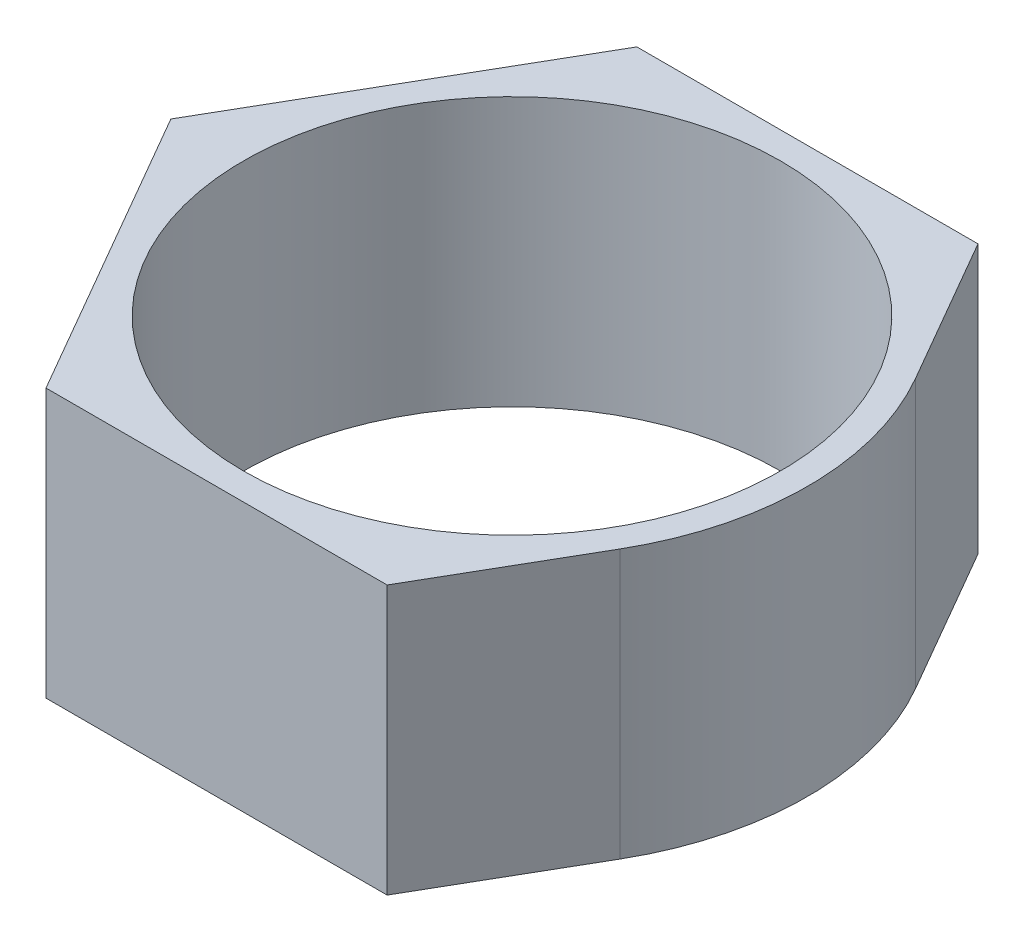
ISO-10303-21;
HEADER;
FILE_DESCRIPTION(('STEP AP214'),'2;1');
FILE_NAME('part.step','',(''),(''),'','','');
FILE_SCHEMA(('AUTOMOTIVE_DESIGN { 1 0 10303 214 1 1 1 1 }'));
ENDSEC;
DATA;
#1=APPLICATION_CONTEXT('core data for automotive mechanical design processes');
#2=APPLICATION_PROTOCOL_DEFINITION('international standard','automotive_design',2000,#1);
#3=PRODUCT_CONTEXT('',#1,'mechanical');
#4=PRODUCT('Part','Part','',(#3));
#5=PRODUCT_RELATED_PRODUCT_CATEGORY('part','',(#4));
#6=PRODUCT_DEFINITION_FORMATION('','',#4);
#7=PRODUCT_DEFINITION_CONTEXT('part definition',#1,'design');
#8=PRODUCT_DEFINITION('design','',#6,#7);
#9=PRODUCT_DEFINITION_SHAPE('','',#8);
#10=(LENGTH_UNIT() NAMED_UNIT(*) SI_UNIT(.MILLI.,.METRE.));
#11=(NAMED_UNIT(*) PLANE_ANGLE_UNIT() SI_UNIT($,.RADIAN.));
#12=(NAMED_UNIT(*) SI_UNIT($,.STERADIAN.) SOLID_ANGLE_UNIT());
#13=UNCERTAINTY_MEASURE_WITH_UNIT(LENGTH_MEASURE(1.E-05),#10,'distance_accuracy_value','');
#14=(GEOMETRIC_REPRESENTATION_CONTEXT(3) GLOBAL_UNCERTAINTY_ASSIGNED_CONTEXT((#13)) GLOBAL_UNIT_ASSIGNED_CONTEXT((#10,
#11,#12)) REPRESENTATION_CONTEXT('',''));
#15=CARTESIAN_POINT('',(0.,0.,0.));
#16=DIRECTION('',(0.,0.,1.));
#17=DIRECTION('',(1.,0.,0.));
#18=AXIS2_PLACEMENT_3D('',#15,#16,#17);
#19=CARTESIAN_POINT('',(0.,10.,0.));
#20=DIRECTION('',(0.,-1.,0.));
#21=DIRECTION('',(0.,0.,-1.));
#22=AXIS2_PLACEMENT_3D('',#19,#20,#21);
#23=CYLINDRICAL_SURFACE('',#22,11.);
#24=CARTESIAN_POINT('',(0.,0.,0.));
#25=DIRECTION('',(0.,1.,0.));
#26=DIRECTION('',(0.,0.,1.));
#27=AXIS2_PLACEMENT_3D('',#24,#25,#26);
#28=CIRCLE('',#27,11.);
#29=CARTESIAN_POINT('',(9.52627944162883,0.,5.5));
#30=VERTEX_POINT('',#29);
#31=CARTESIAN_POINT('',(9.52627944162883,0.,-5.50000000000001));
#32=VERTEX_POINT('',#31);
#33=EDGE_CURVE('E127',#30,#32,#28,.T.);
#34=ORIENTED_EDGE('',*,*,#33,.T.);
#35=DIRECTION('',(0.,-1.,0.));
#36=VECTOR('',#35,1.);
#37=CARTESIAN_POINT('',(9.52627944162883,10.,-5.50000000000001));
#38=LINE('',#37,#36);
#39=CARTESIAN_POINT('',(9.52627944162883,10.,-5.50000000000001));
#40=VERTEX_POINT('',#39);
#41=EDGE_CURVE('E11',#40,#32,#38,.T.);
#42=ORIENTED_EDGE('',*,*,#41,.F.);
#43=CARTESIAN_POINT('',(0.,10.,0.));
#44=DIRECTION('',(0.,1.,0.));
#45=DIRECTION('',(0.,0.,1.));
#46=AXIS2_PLACEMENT_3D('',#43,#44,#45);
#47=CIRCLE('',#46,11.);
#48=CARTESIAN_POINT('',(9.52627944162883,10.,5.5));
#49=VERTEX_POINT('',#48);
#50=EDGE_CURVE('E161',#49,#40,#47,.T.);
#51=ORIENTED_EDGE('',*,*,#50,.F.);
#52=DIRECTION('',(0.,-1.,0.));
#53=VECTOR('',#52,1.);
#54=CARTESIAN_POINT('',(9.52627944162883,10.,5.5));
#55=LINE('',#54,#53);
#56=EDGE_CURVE('E120',#49,#30,#55,.T.);
#57=ORIENTED_EDGE('',*,*,#56,.T.);
#58=EDGE_LOOP('',(#34,#42,#51,#57));
#59=FACE_BOUND('',#58,.T.);
#60=ADVANCED_FACE('F33',(#59),#23,.T.);
#61=CARTESIAN_POINT('',(9.52627944162883,10.,-5.50000000000001));
#62=DIRECTION('',(-0.866025403784438,0.,0.5));
#63=DIRECTION('',(0.5,0.,0.866025403784438));
#64=AXIS2_PLACEMENT_3D('',#61,#62,#63);
#65=PLANE('',#64);
#66=DIRECTION('',(-0.5,0.,-0.866025403784438));
#67=VECTOR('',#66,1.);
#68=CARTESIAN_POINT('',(9.52627944162883,0.,-5.50000000000001));
#69=LINE('',#68,#67);
#70=CARTESIAN_POINT('',(6.35085296108589,0.,-11.));
#71=VERTEX_POINT('',#70);
#72=EDGE_CURVE('E130',#32,#71,#69,.T.);
#73=ORIENTED_EDGE('',*,*,#72,.T.);
#74=DIRECTION('',(0.,-1.,0.));
#75=VECTOR('',#74,1.);
#76=CARTESIAN_POINT('',(6.35085296108589,10.,-11.));
#77=LINE('',#76,#75);
#78=CARTESIAN_POINT('',(6.35085296108589,10.,-11.));
#79=VERTEX_POINT('',#78);
#80=EDGE_CURVE('E42',#79,#71,#77,.T.);
#81=ORIENTED_EDGE('',*,*,#80,.F.);
#82=DIRECTION('',(-0.5,0.,-0.866025403784438));
#83=VECTOR('',#82,1.);
#84=CARTESIAN_POINT('',(9.52627944162883,10.,-5.50000000000001));
#85=LINE('',#84,#83);
#86=EDGE_CURVE('E90',#40,#79,#85,.T.);
#87=ORIENTED_EDGE('',*,*,#86,.F.);
#88=ORIENTED_EDGE('',*,*,#41,.T.);
#89=EDGE_LOOP('',(#73,#81,#87,#88));
#90=FACE_BOUND('',#89,.T.);
#91=ADVANCED_FACE('F179',(#90),#65,.F.);
#92=CARTESIAN_POINT('',(0.,10.,-11.));
#93=DIRECTION('',(0.,0.,1.));
#94=DIRECTION('',(1.,0.,0.));
#95=AXIS2_PLACEMENT_3D('',#92,#93,#94);
#96=PLANE('',#95);
#97=DIRECTION('',(-1.,0.,0.));
#98=VECTOR('',#97,1.);
#99=CARTESIAN_POINT('',(0.,0.,-11.));
#100=LINE('',#99,#98);
#101=CARTESIAN_POINT('',(-6.35085296108589,0.,-11.));
#102=VERTEX_POINT('',#101);
#103=EDGE_CURVE('E132',#71,#102,#100,.T.);
#104=ORIENTED_EDGE('',*,*,#103,.T.);
#105=DIRECTION('',(0.,-1.,0.));
#106=VECTOR('',#105,1.);
#107=CARTESIAN_POINT('',(-6.35085296108589,10.,-11.));
#108=LINE('',#107,#106);
#109=CARTESIAN_POINT('',(-6.35085296108589,10.,-11.));
#110=VERTEX_POINT('',#109);
#111=EDGE_CURVE('E143',#110,#102,#108,.T.);
#112=ORIENTED_EDGE('',*,*,#111,.F.);
#113=DIRECTION('',(-1.,0.,0.));
#114=VECTOR('',#113,1.);
#115=CARTESIAN_POINT('',(0.,10.,-11.));
#116=LINE('',#115,#114);
#117=EDGE_CURVE('E151',#79,#110,#116,.T.);
#118=ORIENTED_EDGE('',*,*,#117,.F.);
#119=ORIENTED_EDGE('',*,*,#80,.T.);
#120=EDGE_LOOP('',(#104,#112,#118,#119));
#121=FACE_BOUND('',#120,.T.);
#122=ADVANCED_FACE('F149',(#121),#96,.F.);
#123=CARTESIAN_POINT('',(-9.52627944162884,10.,-5.5));
#124=DIRECTION('',(0.866025403784439,0.,0.5));
#125=DIRECTION('',(0.5,0.,-0.866025403784439));
#126=AXIS2_PLACEMENT_3D('',#123,#124,#125);
#127=PLANE('',#126);
#128=DIRECTION('',(-0.5,0.,0.866025403784439));
#129=VECTOR('',#128,1.);
#130=CARTESIAN_POINT('',(-9.52627944162884,0.,-5.5));
#131=LINE('',#130,#129);
#132=CARTESIAN_POINT('',(-12.7017059221718,0.,0.));
#133=VERTEX_POINT('',#132);
#134=EDGE_CURVE('E134',#102,#133,#131,.T.);
#135=ORIENTED_EDGE('',*,*,#134,.T.);
#136=DIRECTION('',(0.,-1.,0.));
#137=VECTOR('',#136,1.);
#138=CARTESIAN_POINT('',(-12.7017059221718,10.,0.));
#139=LINE('',#138,#137);
#140=CARTESIAN_POINT('',(-12.7017059221718,10.,0.));
#141=VERTEX_POINT('',#140);
#142=EDGE_CURVE('E115',#141,#133,#139,.T.);
#143=ORIENTED_EDGE('',*,*,#142,.F.);
#144=DIRECTION('',(-0.5,0.,0.866025403784439));
#145=VECTOR('',#144,1.);
#146=CARTESIAN_POINT('',(-9.52627944162884,10.,-5.5));
#147=LINE('',#146,#145);
#148=EDGE_CURVE('E106',#110,#141,#147,.T.);
#149=ORIENTED_EDGE('',*,*,#148,.F.);
#150=ORIENTED_EDGE('',*,*,#111,.T.);
#151=EDGE_LOOP('',(#135,#143,#149,#150));
#152=FACE_BOUND('',#151,.T.);
#153=ADVANCED_FACE('F157',(#152),#127,.F.);
#154=CARTESIAN_POINT('',(-9.52627944162883,10.,5.50000000000001));
#155=DIRECTION('',(0.866025403784439,0.,-0.5));
#156=DIRECTION('',(-0.5,0.,-0.866025403784439));
#157=AXIS2_PLACEMENT_3D('',#154,#155,#156);
#158=PLANE('',#157);
#159=DIRECTION('',(0.5,0.,0.866025403784439));
#160=VECTOR('',#159,1.);
#161=CARTESIAN_POINT('',(-9.52627944162883,0.,5.50000000000001));
#162=LINE('',#161,#160);
#163=CARTESIAN_POINT('',(-6.35085296108589,0.,11.));
#164=VERTEX_POINT('',#163);
#165=EDGE_CURVE('E114',#133,#164,#162,.T.);
#166=ORIENTED_EDGE('',*,*,#165,.T.);
#167=DIRECTION('',(0.,-1.,0.));
#168=VECTOR('',#167,1.);
#169=CARTESIAN_POINT('',(-6.35085296108589,10.,11.));
#170=LINE('',#169,#168);
#171=CARTESIAN_POINT('',(-6.35085296108589,10.,11.));
#172=VERTEX_POINT('',#171);
#173=EDGE_CURVE('E111',#172,#164,#170,.T.);
#174=ORIENTED_EDGE('',*,*,#173,.F.);
#175=DIRECTION('',(0.5,0.,0.866025403784439));
#176=VECTOR('',#175,1.);
#177=CARTESIAN_POINT('',(-9.52627944162883,10.,5.50000000000001));
#178=LINE('',#177,#176);
#179=EDGE_CURVE('E100',#141,#172,#178,.T.);
#180=ORIENTED_EDGE('',*,*,#179,.F.);
#181=ORIENTED_EDGE('',*,*,#142,.T.);
#182=EDGE_LOOP('',(#166,#174,#180,#181));
#183=FACE_BOUND('',#182,.T.);
#184=ADVANCED_FACE('F112',(#183),#158,.F.);
#185=CARTESIAN_POINT('',(0.,10.,11.));
#186=DIRECTION('',(0.,0.,-1.));
#187=DIRECTION('',(-1.,0.,0.));
#188=AXIS2_PLACEMENT_3D('',#185,#186,#187);
#189=PLANE('',#188);
#190=DIRECTION('',(1.,0.,0.));
#191=VECTOR('',#190,1.);
#192=CARTESIAN_POINT('',(0.,0.,11.));
#193=LINE('',#192,#191);
#194=CARTESIAN_POINT('',(6.35085296108589,0.,11.));
#195=VERTEX_POINT('',#194);
#196=EDGE_CURVE('E76',#164,#195,#193,.T.);
#197=ORIENTED_EDGE('',*,*,#196,.T.);
#198=DIRECTION('',(0.,-1.,0.));
#199=VECTOR('',#198,1.);
#200=CARTESIAN_POINT('',(6.35085296108589,10.,11.));
#201=LINE('',#200,#199);
#202=CARTESIAN_POINT('',(6.35085296108589,10.,11.));
#203=VERTEX_POINT('',#202);
#204=EDGE_CURVE('E116',#203,#195,#201,.T.);
#205=ORIENTED_EDGE('',*,*,#204,.F.);
#206=DIRECTION('',(1.,0.,0.));
#207=VECTOR('',#206,1.);
#208=CARTESIAN_POINT('',(0.,10.,11.));
#209=LINE('',#208,#207);
#210=EDGE_CURVE('E104',#172,#203,#209,.T.);
#211=ORIENTED_EDGE('',*,*,#210,.F.);
#212=ORIENTED_EDGE('',*,*,#173,.T.);
#213=EDGE_LOOP('',(#197,#205,#211,#212));
#214=FACE_BOUND('',#213,.T.);
#215=ADVANCED_FACE('F118',(#214),#189,.F.);
#216=CARTESIAN_POINT('',(0.,10.,0.));
#217=DIRECTION('',(0.,-1.,0.));
#218=DIRECTION('',(0.,0.,-1.));
#219=AXIS2_PLACEMENT_3D('',#216,#217,#218);
#220=CYLINDRICAL_SURFACE('',#219,10.);
#221=CARTESIAN_POINT('',(0.,10.,0.));
#222=DIRECTION('',(0.,1.,0.));
#223=DIRECTION('',(0.,0.,1.));
#224=AXIS2_PLACEMENT_3D('',#221,#222,#223);
#225=CIRCLE('',#224,10.);
#226=CARTESIAN_POINT('',(0.,10.,10.));
#227=VERTEX_POINT('',#226);
#228=EDGE_CURVE('E139',#227,#227,#225,.T.);
#229=ORIENTED_EDGE('',*,*,#228,.T.);
#230=EDGE_LOOP('',(#229));
#231=FACE_BOUND('',#230,.T.);
#232=CARTESIAN_POINT('',(0.,0.,0.));
#233=DIRECTION('',(0.,1.,0.));
#234=DIRECTION('',(0.,0.,1.));
#235=AXIS2_PLACEMENT_3D('',#232,#233,#234);
#236=CIRCLE('',#235,10.);
#237=CARTESIAN_POINT('',(0.,0.,10.));
#238=VERTEX_POINT('',#237);
#239=EDGE_CURVE('E124',#238,#238,#236,.T.);
#240=ORIENTED_EDGE('',*,*,#239,.F.);
#241=EDGE_LOOP('',(#240));
#242=FACE_BOUND('',#241,.T.);
#243=ADVANCED_FACE('F35',(#231,#242),#220,.F.);
#244=CARTESIAN_POINT('',(9.52627944162883,10.,5.5));
#245=DIRECTION('',(-0.866025403784439,0.,-0.5));
#246=DIRECTION('',(-0.5,0.,0.866025403784439));
#247=AXIS2_PLACEMENT_3D('',#244,#245,#246);
#248=PLANE('',#247);
#249=DIRECTION('',(0.5,0.,-0.866025403784439));
#250=VECTOR('',#249,1.);
#251=CARTESIAN_POINT('',(9.52627944162883,0.,5.5));
#252=LINE('',#251,#250);
#253=EDGE_CURVE('E82',#195,#30,#252,.T.);
#254=ORIENTED_EDGE('',*,*,#253,.T.);
#255=ORIENTED_EDGE('',*,*,#56,.F.);
#256=DIRECTION('',(0.5,0.,-0.866025403784439));
#257=VECTOR('',#256,1.);
#258=CARTESIAN_POINT('',(9.52627944162883,10.,5.5));
#259=LINE('',#258,#257);
#260=EDGE_CURVE('E50',#203,#49,#259,.T.);
#261=ORIENTED_EDGE('',*,*,#260,.F.);
#262=ORIENTED_EDGE('',*,*,#204,.T.);
#263=EDGE_LOOP('',(#254,#255,#261,#262));
#264=FACE_BOUND('',#263,.T.);
#265=ADVANCED_FACE('F169',(#264),#248,.F.);
#266=CARTESIAN_POINT('',(0.,10.,0.));
#267=DIRECTION('',(0.,1.,0.));
#268=DIRECTION('',(0.,0.,1.));
#269=AXIS2_PLACEMENT_3D('',#266,#267,#268);
#270=PLANE('',#269);
#271=ORIENTED_EDGE('',*,*,#228,.F.);
#272=EDGE_LOOP('',(#271));
#273=FACE_BOUND('',#272,.T.);
#274=ORIENTED_EDGE('',*,*,#50,.T.);
#275=ORIENTED_EDGE('',*,*,#86,.T.);
#276=ORIENTED_EDGE('',*,*,#117,.T.);
#277=ORIENTED_EDGE('',*,*,#148,.T.);
#278=ORIENTED_EDGE('',*,*,#179,.T.);
#279=ORIENTED_EDGE('',*,*,#210,.T.);
#280=ORIENTED_EDGE('',*,*,#260,.T.);
#281=EDGE_LOOP('',(#274,#275,#276,#277,#278,#279,#280));
#282=FACE_BOUND('',#281,.T.);
#283=ADVANCED_FACE('F102',(#273,#282),#270,.T.);
#284=CARTESIAN_POINT('',(0.,0.,0.));
#285=DIRECTION('',(0.,1.,0.));
#286=DIRECTION('',(0.,0.,1.));
#287=AXIS2_PLACEMENT_3D('',#284,#285,#286);
#288=PLANE('',#287);
#289=ORIENTED_EDGE('',*,*,#239,.T.);
#290=EDGE_LOOP('',(#289));
#291=FACE_BOUND('',#290,.T.);
#292=ORIENTED_EDGE('',*,*,#33,.F.);
#293=ORIENTED_EDGE('',*,*,#253,.F.);
#294=ORIENTED_EDGE('',*,*,#196,.F.);
#295=ORIENTED_EDGE('',*,*,#165,.F.);
#296=ORIENTED_EDGE('',*,*,#134,.F.);
#297=ORIENTED_EDGE('',*,*,#103,.F.);
#298=ORIENTED_EDGE('',*,*,#72,.F.);
#299=EDGE_LOOP('',(#292,#293,#294,#295,#296,#297,#298));
#300=FACE_BOUND('',#299,.T.);
#301=ADVANCED_FACE('F155',(#291,#300),#288,.F.);
#302=CLOSED_SHELL('',(#60,#91,#122,#153,#184,#215,#243,#265,#283,#301));
#303=MANIFOLD_SOLID_BREP('B2',#302);
#304=ADVANCED_BREP_SHAPE_REPRESENTATION('',(#18,#303),#14);
#305=SHAPE_DEFINITION_REPRESENTATION(#9,#304);
ENDSEC;
END-ISO-10303-21;
